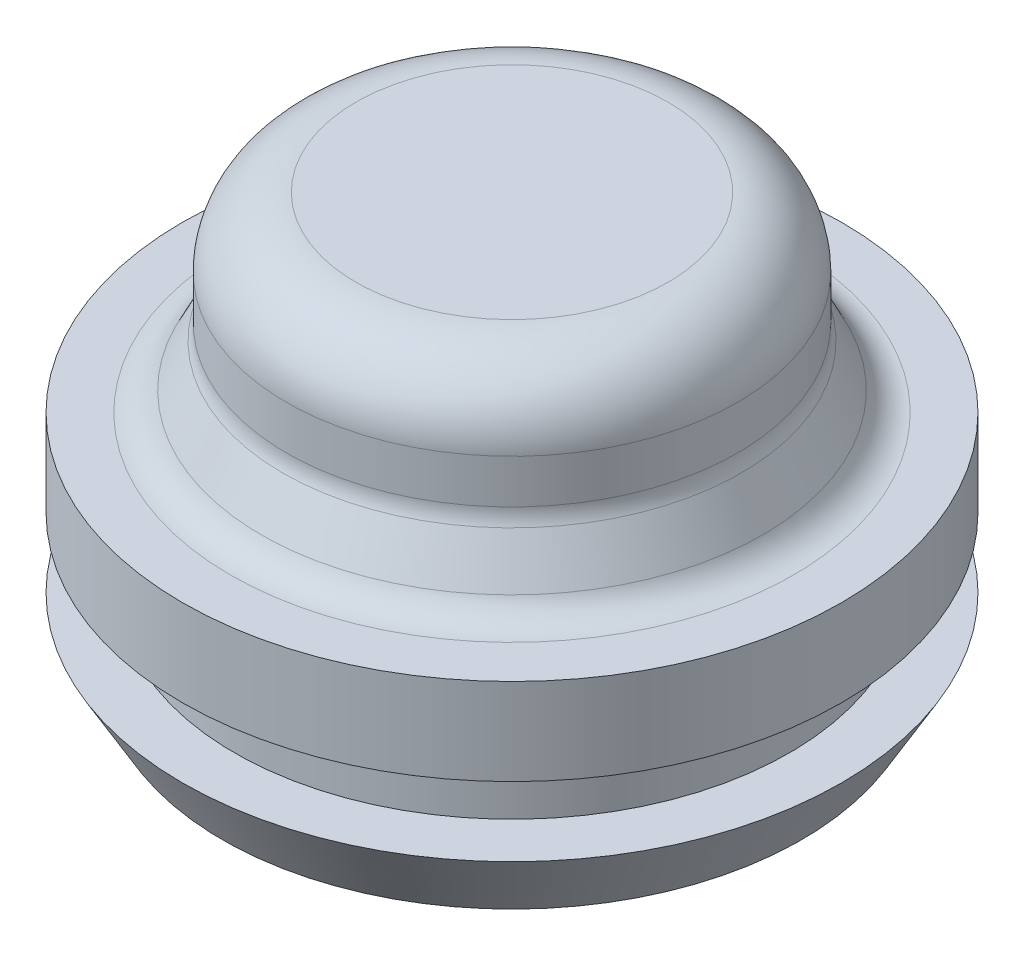
ISO-10303-21;
HEADER;
FILE_DESCRIPTION(('STEP AP214'),'2;1');
FILE_NAME('part.step','',(''),(''),'','','');
FILE_SCHEMA(('AUTOMOTIVE_DESIGN { 1 0 10303 214 1 1 1 1 }'));
ENDSEC;
DATA;
#1=APPLICATION_CONTEXT('core data for automotive mechanical design processes');
#2=APPLICATION_PROTOCOL_DEFINITION('international standard','automotive_design',2000,#1);
#3=PRODUCT_CONTEXT('',#1,'mechanical');
#4=PRODUCT('Part','Part','',(#3));
#5=PRODUCT_RELATED_PRODUCT_CATEGORY('part','',(#4));
#6=PRODUCT_DEFINITION_FORMATION('','',#4);
#7=PRODUCT_DEFINITION_CONTEXT('part definition',#1,'design');
#8=PRODUCT_DEFINITION('design','',#6,#7);
#9=PRODUCT_DEFINITION_SHAPE('','',#8);
#10=(LENGTH_UNIT() NAMED_UNIT(*) SI_UNIT(.MILLI.,.METRE.));
#11=(NAMED_UNIT(*) PLANE_ANGLE_UNIT() SI_UNIT($,.RADIAN.));
#12=(NAMED_UNIT(*) SI_UNIT($,.STERADIAN.) SOLID_ANGLE_UNIT());
#13=UNCERTAINTY_MEASURE_WITH_UNIT(LENGTH_MEASURE(1.E-05),#10,'distance_accuracy_value','');
#14=(GEOMETRIC_REPRESENTATION_CONTEXT(3) GLOBAL_UNCERTAINTY_ASSIGNED_CONTEXT((#13)) GLOBAL_UNIT_ASSIGNED_CONTEXT((#10,
#11,#12)) REPRESENTATION_CONTEXT('',''));
#15=CARTESIAN_POINT('',(0.,0.,0.));
#16=DIRECTION('',(0.,0.,1.));
#17=DIRECTION('',(1.,0.,0.));
#18=AXIS2_PLACEMENT_3D('',#15,#16,#17);
#19=CARTESIAN_POINT('',(0.,0.895003121099837,0.));
#20=DIRECTION('',(0.,-1.,0.));
#21=DIRECTION('',(0.,0.,-1.));
#22=AXIS2_PLACEMENT_3D('',#19,#20,#21);
#23=CONICAL_SURFACE('',#22,5.40499687890016,0.785398163397445);
#24=CARTESIAN_POINT('',(0.,0.,0.));
#25=DIRECTION('',(0.,-1.,0.));
#26=DIRECTION('',(0.,0.,-1.));
#27=AXIS2_PLACEMENT_3D('',#24,#25,#26);
#28=CIRCLE('',#27,6.29999999999999);
#29=CARTESIAN_POINT('',(0.,0.,-6.29999999999999));
#30=VERTEX_POINT('',#29);
#31=EDGE_CURVE('E10',#30,#30,#28,.T.);
#32=ORIENTED_EDGE('',*,*,#31,.T.);
#33=EDGE_LOOP('',(#32));
#34=FACE_BOUND('',#33,.T.);
#35=CARTESIAN_POINT('',(0.,0.895003121099837,0.));
#36=DIRECTION('',(0.,-1.,0.));
#37=DIRECTION('',(0.,0.,-1.));
#38=AXIS2_PLACEMENT_3D('',#35,#36,#37);
#39=CIRCLE('',#38,5.40499687890016);
#40=CARTESIAN_POINT('',(5.40499687890016,0.895003121099837,0.));
#41=VERTEX_POINT('',#40);
#42=EDGE_CURVE('E88',#41,#41,#39,.T.);
#43=ORIENTED_EDGE('',*,*,#42,.F.);
#44=EDGE_LOOP('',(#43));
#45=FACE_BOUND('',#44,.T.);
#46=ADVANCED_FACE('F33',(#34,#45),#23,.F.);
#47=CARTESIAN_POINT('',(8.34529946162077,0.,0.));
#48=DIRECTION('',(0.,-1.,0.));
#49=DIRECTION('',(0.,0.,-1.));
#50=AXIS2_PLACEMENT_3D('',#47,#48,#49);
#51=PLANE('',#50);
#52=CARTESIAN_POINT('',(0.,0.,0.));
#53=DIRECTION('',(0.,-1.,0.));
#54=DIRECTION('',(0.,0.,-1.));
#55=AXIS2_PLACEMENT_3D('',#52,#53,#54);
#56=CIRCLE('',#55,8.34529946162077);
#57=CARTESIAN_POINT('',(0.,0.,-8.34529946162077));
#58=VERTEX_POINT('',#57);
#59=EDGE_CURVE('E39',#58,#58,#56,.T.);
#60=ORIENTED_EDGE('',*,*,#59,.T.);
#61=EDGE_LOOP('',(#60));
#62=FACE_BOUND('',#61,.T.);
#63=ORIENTED_EDGE('',*,*,#31,.F.);
#64=EDGE_LOOP('',(#63));
#65=FACE_BOUND('',#64,.T.);
#66=ADVANCED_FACE('F96',(#62,#65),#51,.T.);
#67=CARTESIAN_POINT('',(0.,0.,0.));
#68=DIRECTION('',(0.,1.,0.));
#69=DIRECTION('',(0.,0.,1.));
#70=AXIS2_PLACEMENT_3D('',#67,#68,#69);
#71=CONICAL_SURFACE('',#70,8.34529946162077,0.523598775598293);
#72=CARTESIAN_POINT('',(0.,2.,0.));
#73=DIRECTION('',(0.,-1.,0.));
#74=DIRECTION('',(0.,0.,-1.));
#75=AXIS2_PLACEMENT_3D('',#72,#73,#74);
#76=CIRCLE('',#75,9.5);
#77=CARTESIAN_POINT('',(0.,2.,-9.5));
#78=VERTEX_POINT('',#77);
#79=EDGE_CURVE('E43',#78,#78,#76,.T.);
#80=ORIENTED_EDGE('',*,*,#79,.T.);
#81=EDGE_LOOP('',(#80));
#82=FACE_BOUND('',#81,.T.);
#83=ORIENTED_EDGE('',*,*,#59,.F.);
#84=EDGE_LOOP('',(#83));
#85=FACE_BOUND('',#84,.T.);
#86=ADVANCED_FACE('F100',(#82,#85),#71,.T.);
#87=CARTESIAN_POINT('',(9.5,2.,0.));
#88=DIRECTION('',(0.,1.,0.));
#89=DIRECTION('',(0.,0.,1.));
#90=AXIS2_PLACEMENT_3D('',#87,#88,#89);
#91=PLANE('',#90);
#92=CARTESIAN_POINT('',(0.,2.,0.));
#93=DIRECTION('',(0.,-1.,0.));
#94=DIRECTION('',(0.,0.,-1.));
#95=AXIS2_PLACEMENT_3D('',#92,#93,#94);
#96=CIRCLE('',#95,8.);
#97=CARTESIAN_POINT('',(0.,2.,-8.));
#98=VERTEX_POINT('',#97);
#99=EDGE_CURVE('E47',#98,#98,#96,.T.);
#100=ORIENTED_EDGE('',*,*,#99,.T.);
#101=EDGE_LOOP('',(#100));
#102=FACE_BOUND('',#101,.T.);
#103=ORIENTED_EDGE('',*,*,#79,.F.);
#104=EDGE_LOOP('',(#103));
#105=FACE_BOUND('',#104,.T.);
#106=ADVANCED_FACE('F104',(#102,#105),#91,.T.);
#107=CARTESIAN_POINT('',(0.,0.,0.));
#108=DIRECTION('',(0.,-1.,0.));
#109=DIRECTION('',(0.,0.,-1.));
#110=AXIS2_PLACEMENT_3D('',#107,#108,#109);
#111=CYLINDRICAL_SURFACE('',#110,8.);
#112=CARTESIAN_POINT('',(0.,4.,0.));
#113=DIRECTION('',(0.,-1.,0.));
#114=DIRECTION('',(0.,0.,-1.));
#115=AXIS2_PLACEMENT_3D('',#112,#113,#114);
#116=CIRCLE('',#115,8.);
#117=CARTESIAN_POINT('',(0.,4.,-8.));
#118=VERTEX_POINT('',#117);
#119=EDGE_CURVE('E52',#118,#118,#116,.T.);
#120=ORIENTED_EDGE('',*,*,#119,.T.);
#121=EDGE_LOOP('',(#120));
#122=FACE_BOUND('',#121,.T.);
#123=ORIENTED_EDGE('',*,*,#99,.F.);
#124=EDGE_LOOP('',(#123));
#125=FACE_BOUND('',#124,.T.);
#126=ADVANCED_FACE('F111',(#122,#125),#111,.T.);
#127=CARTESIAN_POINT('',(8.,4.,0.));
#128=DIRECTION('',(0.,-1.,0.));
#129=DIRECTION('',(0.,0.,-1.));
#130=AXIS2_PLACEMENT_3D('',#127,#128,#129);
#131=PLANE('',#130);
#132=CARTESIAN_POINT('',(0.,4.,0.));
#133=DIRECTION('',(0.,-1.,0.));
#134=DIRECTION('',(0.,0.,-1.));
#135=AXIS2_PLACEMENT_3D('',#132,#133,#134);
#136=CIRCLE('',#135,9.5);
#137=CARTESIAN_POINT('',(0.,4.,-9.5));
#138=VERTEX_POINT('',#137);
#139=EDGE_CURVE('E55',#138,#138,#136,.T.);
#140=ORIENTED_EDGE('',*,*,#139,.T.);
#141=EDGE_LOOP('',(#140));
#142=FACE_BOUND('',#141,.T.);
#143=ORIENTED_EDGE('',*,*,#119,.F.);
#144=EDGE_LOOP('',(#143));
#145=FACE_BOUND('',#144,.T.);
#146=ADVANCED_FACE('F115',(#142,#145),#131,.T.);
#147=CARTESIAN_POINT('',(0.,0.,0.));
#148=DIRECTION('',(0.,-1.,0.));
#149=DIRECTION('',(0.,0.,-1.));
#150=AXIS2_PLACEMENT_3D('',#147,#148,#149);
#151=CYLINDRICAL_SURFACE('',#150,9.5);
#152=CARTESIAN_POINT('',(0.,6.5,0.));
#153=DIRECTION('',(0.,-1.,0.));
#154=DIRECTION('',(0.,0.,-1.));
#155=AXIS2_PLACEMENT_3D('',#152,#153,#154);
#156=CIRCLE('',#155,9.5);
#157=CARTESIAN_POINT('',(0.,6.5,-9.5));
#158=VERTEX_POINT('',#157);
#159=EDGE_CURVE('E58',#158,#158,#156,.T.);
#160=ORIENTED_EDGE('',*,*,#159,.T.);
#161=EDGE_LOOP('',(#160));
#162=FACE_BOUND('',#161,.T.);
#163=ORIENTED_EDGE('',*,*,#139,.F.);
#164=EDGE_LOOP('',(#163));
#165=FACE_BOUND('',#164,.T.);
#166=ADVANCED_FACE('F119',(#162,#165),#151,.T.);
#167=CARTESIAN_POINT('',(9.5,6.5,0.));
#168=DIRECTION('',(0.,1.,0.));
#169=DIRECTION('',(0.,0.,1.));
#170=AXIS2_PLACEMENT_3D('',#167,#168,#169);
#171=PLANE('',#170);
#172=CARTESIAN_POINT('',(0.,6.5,0.));
#173=DIRECTION('',(0.,-1.,0.));
#174=DIRECTION('',(0.,0.,-1.));
#175=AXIS2_PLACEMENT_3D('',#172,#173,#174);
#176=CIRCLE('',#175,8.1180339887499);
#177=CARTESIAN_POINT('',(0.,6.5,-8.1180339887499));
#178=VERTEX_POINT('',#177);
#179=EDGE_CURVE('E61',#178,#178,#176,.T.);
#180=ORIENTED_EDGE('',*,*,#179,.T.);
#181=EDGE_LOOP('',(#180));
#182=FACE_BOUND('',#181,.T.);
#183=ORIENTED_EDGE('',*,*,#159,.F.);
#184=EDGE_LOOP('',(#183));
#185=FACE_BOUND('',#184,.T.);
#186=ADVANCED_FACE('F123',(#182,#185),#171,.T.);
#187=CARTESIAN_POINT('',(0.,7.5,0.));
#188=DIRECTION('',(0.,-1.,0.));
#189=DIRECTION('',(0.,0.,-1.));
#190=AXIS2_PLACEMENT_3D('',#187,#188,#189);
#191=TOROIDAL_SURFACE('',#190,8.11803398874989,1.);
#192=CARTESIAN_POINT('',(0.,7.05278640450004,0.));
#193=DIRECTION('',(0.,-1.,0.));
#194=DIRECTION('',(0.,0.,-1.));
#195=AXIS2_PLACEMENT_3D('',#192,#193,#194);
#196=CIRCLE('',#195,7.22360679774998);
#197=CARTESIAN_POINT('',(0.,7.05278640450004,-7.22360679774998));
#198=VERTEX_POINT('',#197);
#199=EDGE_CURVE('E64',#198,#198,#196,.T.);
#200=ORIENTED_EDGE('',*,*,#199,.T.);
#201=EDGE_LOOP('',(#200));
#202=FACE_BOUND('',#201,.T.);
#203=ORIENTED_EDGE('',*,*,#179,.F.);
#204=EDGE_LOOP('',(#203));
#205=FACE_BOUND('',#204,.T.);
#206=ADVANCED_FACE('F127',(#202,#205),#191,.F.);
#207=CARTESIAN_POINT('',(0.,7.05278640450004,0.));
#208=DIRECTION('',(0.,-1.,0.));
#209=DIRECTION('',(0.,0.,-1.));
#210=AXIS2_PLACEMENT_3D('',#207,#208,#209);
#211=CONICAL_SURFACE('',#210,7.22360679774998,0.463647609000805);
#212=CARTESIAN_POINT('',(0.,8.28885438199983,0.));
#213=DIRECTION('',(0.,-1.,0.));
#214=DIRECTION('',(0.,0.,-1.));
#215=AXIS2_PLACEMENT_3D('',#212,#213,#214);
#216=CIRCLE('',#215,6.60557280900009);
#217=CARTESIAN_POINT('',(0.,8.28885438199983,-6.60557280900009));
#218=VERTEX_POINT('',#217);
#219=EDGE_CURVE('E67',#218,#218,#216,.T.);
#220=ORIENTED_EDGE('',*,*,#219,.T.);
#221=EDGE_LOOP('',(#220));
#222=FACE_BOUND('',#221,.T.);
#223=ORIENTED_EDGE('',*,*,#199,.F.);
#224=EDGE_LOOP('',(#223));
#225=FACE_BOUND('',#224,.T.);
#226=ADVANCED_FACE('F131',(#222,#225),#211,.T.);
#227=CARTESIAN_POINT('',(0.,8.73606797749979,0.));
#228=DIRECTION('',(0.,-1.,0.));
#229=DIRECTION('',(0.,0.,-1.));
#230=AXIS2_PLACEMENT_3D('',#227,#228,#229);
#231=TOROIDAL_SURFACE('',#230,7.5,1.);
#232=CARTESIAN_POINT('',(0.,8.73606797749979,0.));
#233=DIRECTION('',(0.,-1.,0.));
#234=DIRECTION('',(0.,0.,-1.));
#235=AXIS2_PLACEMENT_3D('',#232,#233,#234);
#236=CIRCLE('',#235,6.5);
#237=CARTESIAN_POINT('',(0.,8.73606797749979,-6.5));
#238=VERTEX_POINT('',#237);
#239=EDGE_CURVE('E70',#238,#238,#236,.T.);
#240=ORIENTED_EDGE('',*,*,#239,.T.);
#241=EDGE_LOOP('',(#240));
#242=FACE_BOUND('',#241,.T.);
#243=ORIENTED_EDGE('',*,*,#219,.F.);
#244=EDGE_LOOP('',(#243));
#245=FACE_BOUND('',#244,.T.);
#246=ADVANCED_FACE('F135',(#242,#245),#231,.F.);
#247=CARTESIAN_POINT('',(0.,0.,0.));
#248=DIRECTION('',(0.,-1.,0.));
#249=DIRECTION('',(0.,0.,-1.));
#250=AXIS2_PLACEMENT_3D('',#247,#248,#249);
#251=CYLINDRICAL_SURFACE('',#250,6.5);
#252=CARTESIAN_POINT('',(0.,9.99999999999999,0.));
#253=DIRECTION('',(0.,-1.,0.));
#254=DIRECTION('',(0.,0.,-1.));
#255=AXIS2_PLACEMENT_3D('',#252,#253,#254);
#256=CIRCLE('',#255,6.5);
#257=CARTESIAN_POINT('',(0.,9.99999999999999,-6.5));
#258=VERTEX_POINT('',#257);
#259=EDGE_CURVE('E73',#258,#258,#256,.T.);
#260=ORIENTED_EDGE('',*,*,#259,.T.);
#261=EDGE_LOOP('',(#260));
#262=FACE_BOUND('',#261,.T.);
#263=ORIENTED_EDGE('',*,*,#239,.F.);
#264=EDGE_LOOP('',(#263));
#265=FACE_BOUND('',#264,.T.);
#266=ADVANCED_FACE('F139',(#262,#265),#251,.T.);
#267=CARTESIAN_POINT('',(0.,9.99999999999999,0.));
#268=DIRECTION('',(0.,-1.,0.));
#269=DIRECTION('',(0.,0.,-1.));
#270=AXIS2_PLACEMENT_3D('',#267,#268,#269);
#271=TOROIDAL_SURFACE('',#270,4.5,2.);
#272=CARTESIAN_POINT('',(0.,12.,0.));
#273=DIRECTION('',(0.,-1.,0.));
#274=DIRECTION('',(0.,0.,-1.));
#275=AXIS2_PLACEMENT_3D('',#272,#273,#274);
#276=CIRCLE('',#275,4.5);
#277=CARTESIAN_POINT('',(0.,12.,-4.5));
#278=VERTEX_POINT('',#277);
#279=EDGE_CURVE('E76',#278,#278,#276,.T.);
#280=ORIENTED_EDGE('',*,*,#279,.T.);
#281=EDGE_LOOP('',(#280));
#282=FACE_BOUND('',#281,.T.);
#283=ORIENTED_EDGE('',*,*,#259,.F.);
#284=EDGE_LOOP('',(#283));
#285=FACE_BOUND('',#284,.T.);
#286=ADVANCED_FACE('F143',(#282,#285),#271,.T.);
#287=CARTESIAN_POINT('',(4.5,12.,0.));
#288=DIRECTION('',(0.,1.,0.));
#289=DIRECTION('',(0.,0.,1.));
#290=AXIS2_PLACEMENT_3D('',#287,#288,#289);
#291=PLANE('',#290);
#292=ORIENTED_EDGE('',*,*,#279,.F.);
#293=EDGE_LOOP('',(#292));
#294=FACE_BOUND('',#293,.T.);
#295=ADVANCED_FACE('F147',(#294),#291,.T.);
#296=CARTESIAN_POINT('',(4.3,11.,0.));
#297=DIRECTION('',(0.,-1.,0.));
#298=DIRECTION('',(0.,0.,-1.));
#299=AXIS2_PLACEMENT_3D('',#296,#297,#298);
#300=PLANE('',#299);
#301=CARTESIAN_POINT('',(0.,11.,0.));
#302=DIRECTION('',(0.,-1.,0.));
#303=DIRECTION('',(0.,0.,-1.));
#304=AXIS2_PLACEMENT_3D('',#301,#302,#303);
#305=CIRCLE('',#304,4.3);
#306=CARTESIAN_POINT('',(0.,11.,-4.3));
#307=VERTEX_POINT('',#306);
#308=EDGE_CURVE('E79',#307,#307,#305,.T.);
#309=ORIENTED_EDGE('',*,*,#308,.T.);
#310=EDGE_LOOP('',(#309));
#311=FACE_BOUND('',#310,.T.);
#312=ADVANCED_FACE('F151',(#311),#300,.T.);
#313=CARTESIAN_POINT('',(0.,9.99999999999999,0.));
#314=DIRECTION('',(0.,-1.,0.));
#315=DIRECTION('',(0.,0.,-1.));
#316=AXIS2_PLACEMENT_3D('',#313,#314,#315);
#317=TOROIDAL_SURFACE('',#316,4.3,1.);
#318=CARTESIAN_POINT('',(0.,9.99999999999999,0.));
#319=DIRECTION('',(0.,-1.,0.));
#320=DIRECTION('',(0.,0.,-1.));
#321=AXIS2_PLACEMENT_3D('',#318,#319,#320);
#322=CIRCLE('',#321,5.3);
#323=CARTESIAN_POINT('',(0.,9.99999999999999,-5.3));
#324=VERTEX_POINT('',#323);
#325=EDGE_CURVE('E82',#324,#324,#322,.T.);
#326=ORIENTED_EDGE('',*,*,#325,.T.);
#327=EDGE_LOOP('',(#326));
#328=FACE_BOUND('',#327,.T.);
#329=ORIENTED_EDGE('',*,*,#308,.F.);
#330=EDGE_LOOP('',(#329));
#331=FACE_BOUND('',#330,.T.);
#332=ADVANCED_FACE('F155',(#328,#331),#317,.F.);
#333=CARTESIAN_POINT('',(0.,0.,0.));
#334=DIRECTION('',(0.,-1.,0.));
#335=DIRECTION('',(0.,0.,-1.));
#336=AXIS2_PLACEMENT_3D('',#333,#334,#335);
#337=CYLINDRICAL_SURFACE('',#336,5.3);
#338=CARTESIAN_POINT('',(0.,6.31247222208505,0.));
#339=DIRECTION('',(0.,-1.,0.));
#340=DIRECTION('',(0.,0.,-1.));
#341=AXIS2_PLACEMENT_3D('',#338,#339,#340);
#342=CIRCLE('',#341,5.3);
#343=CARTESIAN_POINT('',(5.3,6.31247222208505,0.));
#344=VERTEX_POINT('',#343);
#345=EDGE_CURVE('E85',#344,#344,#342,.T.);
#346=ORIENTED_EDGE('',*,*,#345,.T.);
#347=EDGE_LOOP('',(#346));
#348=FACE_BOUND('',#347,.T.);
#349=ORIENTED_EDGE('',*,*,#325,.F.);
#350=EDGE_LOOP('',(#349));
#351=FACE_BOUND('',#350,.T.);
#352=ADVANCED_FACE('F159',(#348,#351),#337,.F.);
#353=CARTESIAN_POINT('',(0.,3.5,0.));
#354=DIRECTION('',(0.,-1.,0.));
#355=DIRECTION('',(1.,0.,0.));
#356=AXIS2_PLACEMENT_3D('',#353,#354,#355);
#357=SPHERICAL_SURFACE('',#356,6.);
#358=CARTESIAN_POINT('',(5.40499687890016,0.895003121099837,0.));
#359=CARTESIAN_POINT('',(5.43042249529371,0.947757040000293,0.));
#360=CARTESIAN_POINT('',(5.45507530163745,1.0008834082284,0.));
#361=CARTESIAN_POINT('',(5.50281521803713,1.10783502567606,0.));
#362=CARTESIAN_POINT('',(5.52590232809308,1.16166027489562,0.));
#363=CARTESIAN_POINT('',(5.57049077572903,1.26996363666232,0.));
#364=CARTESIAN_POINT('',(5.59199211330903,1.32444174920947,0.));
#365=CARTESIAN_POINT('',(5.63339065894422,1.4340040997275,0.));
#366=CARTESIAN_POINT('',(5.65328786699941,1.48908833769839,0.));
#367=CARTESIAN_POINT('',(5.69146107538265,1.59981572454692,0.));
#368=CARTESIAN_POINT('',(5.70973707571069,1.65545887342456,0.));
#369=CARTESIAN_POINT('',(5.74465220611784,1.76725637689003,0.));
#370=CARTESIAN_POINT('',(5.76129133619695,1.82341073147786,0.));
#371=CARTESIAN_POINT('',(5.79291845995098,1.93618250599999,0.));
#372=CARTESIAN_POINT('',(5.80790645362589,1.9927999259343,0.));
#373=CARTESIAN_POINT('',(5.83621845578618,2.10644929297309,0.));
#374=CARTESIAN_POINT('',(5.84954246427155,2.16348124007759,0.));
#375=CARTESIAN_POINT('',(5.87451507330181,2.27791076812893,0.));
#376=CARTESIAN_POINT('',(5.8861636738467,2.33530834907578,0.));
#377=CARTESIAN_POINT('',(5.90777548070209,2.45041993796738,0.));
#378=CARTESIAN_POINT('',(5.91773868701259,2.50813394591214,0.));
#379=CARTESIAN_POINT('',(5.9359711639547,2.62382891069883,0.));
#380=CARTESIAN_POINT('',(5.94424043458633,2.68180986754076,0.));
#381=CARTESIAN_POINT('',(5.95907795094347,2.79798902316203,0.));
#382=CARTESIAN_POINT('',(5.96564619666899,2.85618722194136,0.));
#383=CARTESIAN_POINT('',(5.9770760322694,2.97275096823772,0.));
#384=CARTESIAN_POINT('',(5.98193762214429,3.03111651575475,0.));
#385=CARTESIAN_POINT('',(5.98994997821227,3.14796492285874,0.));
#386=CARTESIAN_POINT('',(5.99310074440536,3.20644778244571,0.));
#387=CARTESIAN_POINT('',(5.99768875196411,3.32348067645052,0.));
#388=CARTESIAN_POINT('',(5.99912599332977,3.38203071086836,0.));
#389=CARTESIAN_POINT('',(6.00028571908952,3.49914775970695,0.));
#390=CARTESIAN_POINT('',(6.0000082034836,3.55771477412771,0.));
#391=CARTESIAN_POINT('',(5.99773865321377,3.67481557358729,0.));
#392=CARTESIAN_POINT('',(5.99574661854985,3.73334935862611,0.));
#393=CARTESIAN_POINT('',(5.99004973793136,3.85033351842443,0.));
#394=CARTESIAN_POINT('',(5.98634489197678,3.90878389318393,0.));
#395=CARTESIAN_POINT('',(5.97722556493405,4.02555112303369,0.));
#396=CARTESIAN_POINT('',(5.97181108384588,4.08386797812395,0.));
#397=CARTESIAN_POINT('',(5.95927712835984,4.20031817371149,0.));
#398=CARTESIAN_POINT('',(5.95215765396196,4.25845151420876,0.));
#399=CARTESIAN_POINT('',(5.9362198153676,4.37448484301318,0.));
#400=CARTESIAN_POINT('',(5.92740145117111,4.43238483132033,0.));
#401=CARTESIAN_POINT('',(5.90807339294611,4.54790181820005,0.));
#402=CARTESIAN_POINT('',(5.8975636989176,4.60551881677262,0.));
#403=CARTESIAN_POINT('',(5.87486199096634,4.72042042924405,0.));
#404=CARTESIAN_POINT('',(5.8626699770436,4.7777050431429,0.));
#405=CARTESIAN_POINT('',(5.83661408150055,4.8918927762851,0.));
#406=CARTESIAN_POINT('',(5.82275019988023,4.94879589552844,0.));
#407=CARTESIAN_POINT('',(5.79336245439253,5.06217185641514,0.));
#408=CARTESIAN_POINT('',(5.77783859052514,5.11864469805849,0.));
#409=CARTESIAN_POINT('',(5.74514418922395,5.23111168974138,0.));
#410=CARTESIAN_POINT('',(5.72797365179015,5.28710583978093,0.));
#411=CARTESIAN_POINT('',(5.69200062323899,5.39856744439292,0.));
#412=CARTESIAN_POINT('',(5.67319813212162,5.45403489896537,0.));
#413=CARTESIAN_POINT('',(5.63397731697731,5.56439556121363,0.));
#414=CARTESIAN_POINT('',(5.61355899295037,5.61928876888945,0.));
#415=CARTESIAN_POINT('',(5.571124011217,5.72845387486138,0.));
#416=CARTESIAN_POINT('',(5.54910735351058,5.7827257731575,0.));
#417=CARTESIAN_POINT('',(5.50349459925305,5.8906017430525,0.));
#418=CARTESIAN_POINT('',(5.47989850270193,5.94420581465139,0.));
#419=CARTESIAN_POINT('',(5.4311470250082,6.05070013964212,0.));
#420=CARTESIAN_POINT('',(5.40599164386559,6.10359039303396,0.));
#421=CARTESIAN_POINT('',(5.35414344118264,6.20861187641268,0.));
#422=CARTESIAN_POINT('',(5.32745061964231,6.26074310639957,0.));
#423=CARTESIAN_POINT('',(5.3,6.31247222208505,0.));
#424=B_SPLINE_CURVE_WITH_KNOTS('',3,(#358,#359,#360,#361,#362,#363,#364,#365,#366,#367,#368,
#369,#370,#371,#372,#373,#374,#375,#376,#377,#378,#379,#380,#381,#382,#383,#384,#385,#386,#387,
#388,#389,#390,#391,#392,#393,#394,#395,#396,#397,#398,#399,#400,#401,#402,#403,#404,#405,#406,
#407,#408,#409,#410,#411,#412,#413,#414,#415,#416,#417,#418,#419,#420,#421,#422,#423),
.UNSPECIFIED.,.F.,.F.,(4,2,2,2,2,2,2,2,2,2,2,2,2,2,2,2,2,2,2,2,2,2,2,2,2,2,2,2,2,2,2,2,4),(0.,
0.175677910758696,0.351355821517393,0.527033732276089,0.702711643034785,0.878389553793482,
1.05406746455218,1.22974537531087,1.40542328606957,1.58110119682827,1.75677910758696,
1.93245701834566,2.10813492910436,2.28381283986305,2.45949075062175,2.63516866138045,
2.81084657213914,2.98652448289784,3.16220239365653,3.33788030441523,3.51355821517393,
3.68923612593262,3.86491403669132,4.04059194745002,4.21626985820871,4.39194776896741,
4.56762567972611,4.7433035904848,4.9189815012435,5.09465941200219,5.27033732276089,
5.44601523351959,5.62169314427828),.UNSPECIFIED.);
#425=EDGE_CURVE('BSEAM92',#41,#344,#424,.T.);
#426=ORIENTED_EDGE('',*,*,#42,.T.);
#427=ORIENTED_EDGE('',*,*,#345,.F.);
#428=ORIENTED_EDGE('',*,*,#425,.T.);
#429=ORIENTED_EDGE('',*,*,#425,.F.);
#430=EDGE_LOOP('',(#426,#428,#427,#429));
#431=FACE_BOUND('',#430,.T.);
#432=ADVANCED_FACE('F92',(#431),#357,.F.);
#433=CLOSED_SHELL('',(#46,#66,#86,#106,#126,#146,#166,#186,#206,#226,#246,#266,#286,#295,#312,
#332,#352,#432));
#434=MANIFOLD_SOLID_BREP('B2',#433);
#435=ADVANCED_BREP_SHAPE_REPRESENTATION('',(#18,#434),#14);
#436=SHAPE_DEFINITION_REPRESENTATION(#9,#435);
ENDSEC;
END-ISO-10303-21;
